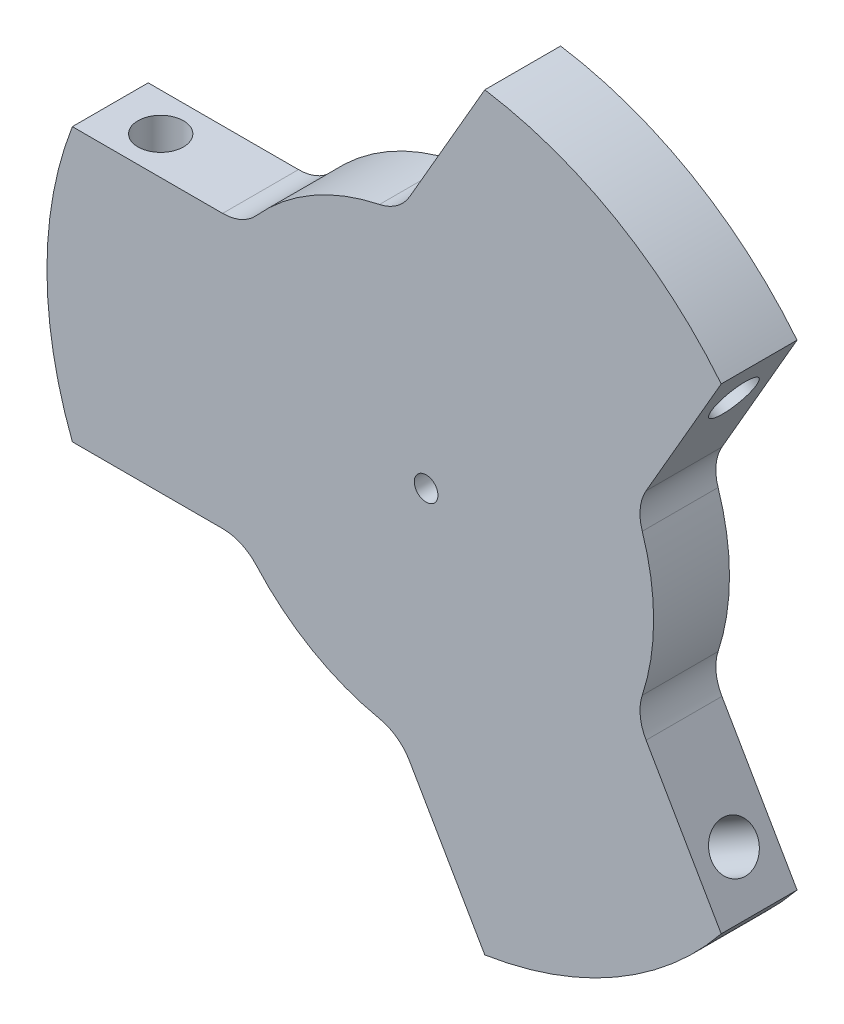
ISO-10303-21;
HEADER;
FILE_DESCRIPTION(('STEP AP214'),'2;1');
FILE_NAME('part.step','',(''),(''),'','','');
FILE_SCHEMA(('AUTOMOTIVE_DESIGN { 1 0 10303 214 1 1 1 1 }'));
ENDSEC;
DATA;
#1=APPLICATION_CONTEXT('core data for automotive mechanical design processes');
#2=APPLICATION_PROTOCOL_DEFINITION('international standard','automotive_design',2000,#1);
#3=PRODUCT_CONTEXT('',#1,'mechanical');
#4=PRODUCT('Part','Part','',(#3));
#5=PRODUCT_RELATED_PRODUCT_CATEGORY('part','',(#4));
#6=PRODUCT_DEFINITION_FORMATION('','',#4);
#7=PRODUCT_DEFINITION_CONTEXT('part definition',#1,'design');
#8=PRODUCT_DEFINITION('design','',#6,#7);
#9=PRODUCT_DEFINITION_SHAPE('','',#8);
#10=(LENGTH_UNIT() NAMED_UNIT(*) SI_UNIT(.MILLI.,.METRE.));
#11=(NAMED_UNIT(*) PLANE_ANGLE_UNIT() SI_UNIT($,.RADIAN.));
#12=(NAMED_UNIT(*) SI_UNIT($,.STERADIAN.) SOLID_ANGLE_UNIT());
#13=UNCERTAINTY_MEASURE_WITH_UNIT(LENGTH_MEASURE(1.E-05),#10,'distance_accuracy_value','');
#14=(GEOMETRIC_REPRESENTATION_CONTEXT(3) GLOBAL_UNCERTAINTY_ASSIGNED_CONTEXT((#13)) GLOBAL_UNIT_ASSIGNED_CONTEXT((#10,
#11,#12)) REPRESENTATION_CONTEXT('',''));
#15=CARTESIAN_POINT('',(0.,0.,0.));
#16=DIRECTION('',(0.,0.,1.));
#17=DIRECTION('',(1.,0.,0.));
#18=AXIS2_PLACEMENT_3D('',#15,#16,#17);
#19=CARTESIAN_POINT('',(0.,0.,5.));
#20=DIRECTION('',(0.,0.,-1.));
#21=DIRECTION('',(-1.,0.,0.));
#22=AXIS2_PLACEMENT_3D('',#19,#20,#21);
#23=CYLINDRICAL_SURFACE('',#22,25.);
#24=CARTESIAN_POINT('',(0.,0.,0.));
#25=DIRECTION('',(0.,0.,1.));
#26=DIRECTION('',(1.,0.,0.));
#27=AXIS2_PLACEMENT_3D('',#24,#25,#26);
#28=CIRCLE('',#27,25.);
#29=CARTESIAN_POINT('',(3.86767515563069,-24.6990098767242,0.));
#30=VERTEX_POINT('',#29);
#31=CARTESIAN_POINT('',(19.4561324237506,-15.6990098767241,0.));
#32=VERTEX_POINT('',#31);
#33=EDGE_CURVE('E197',#30,#32,#28,.T.);
#34=ORIENTED_EDGE('',*,*,#33,.T.);
#35=DIRECTION('',(0.,0.,1.));
#36=VECTOR('',#35,1.);
#37=CARTESIAN_POINT('',(19.4561324237506,-15.6990098767241,0.));
#38=LINE('',#37,#36);
#39=CARTESIAN_POINT('',(19.4561324237506,-15.6990098767241,5.));
#40=VERTEX_POINT('',#39);
#41=EDGE_CURVE('E192',#32,#40,#38,.T.);
#42=ORIENTED_EDGE('',*,*,#41,.T.);
#43=CARTESIAN_POINT('',(0.,0.,5.));
#44=DIRECTION('',(0.,0.,1.));
#45=DIRECTION('',(1.,0.,0.));
#46=AXIS2_PLACEMENT_3D('',#43,#44,#45);
#47=CIRCLE('',#46,25.);
#48=CARTESIAN_POINT('',(3.86767515563069,-24.6990098767242,5.));
#49=VERTEX_POINT('',#48);
#50=EDGE_CURVE('E212',#49,#40,#47,.T.);
#51=ORIENTED_EDGE('',*,*,#50,.F.);
#52=DIRECTION('',(0.,0.,1.));
#53=VECTOR('',#52,1.);
#54=CARTESIAN_POINT('',(3.86767515563069,-24.6990098767242,0.));
#55=LINE('',#54,#53);
#56=EDGE_CURVE('E306',#30,#49,#55,.T.);
#57=ORIENTED_EDGE('',*,*,#56,.F.);
#58=EDGE_LOOP('',(#34,#42,#51,#57));
#59=FACE_BOUND('',#58,.T.);
#60=ADVANCED_FACE('F38',(#59),#23,.T.);
#61=CARTESIAN_POINT('',(19.4561324237505,15.6990098767242,5.));
#62=VERTEX_POINT('',#61);
#63=CARTESIAN_POINT('',(3.86767515563063,24.6990098767242,5.));
#64=VERTEX_POINT('',#63);
#65=EDGE_CURVE('E191',#62,#64,#47,.T.);
#66=ORIENTED_EDGE('',*,*,#65,.F.);
#67=DIRECTION('',(0.,0.,1.));
#68=VECTOR('',#67,1.);
#69=CARTESIAN_POINT('',(19.4561324237505,15.6990098767242,0.));
#70=LINE('',#69,#68);
#71=CARTESIAN_POINT('',(19.4561324237505,15.6990098767242,0.));
#72=VERTEX_POINT('',#71);
#73=EDGE_CURVE('E174',#72,#62,#70,.T.);
#74=ORIENTED_EDGE('',*,*,#73,.F.);
#75=CARTESIAN_POINT('',(3.86767515563063,24.6990098767242,0.));
#76=VERTEX_POINT('',#75);
#77=EDGE_CURVE('E188',#72,#76,#28,.T.);
#78=ORIENTED_EDGE('',*,*,#77,.T.);
#79=DIRECTION('',(0.,0.,1.));
#80=VECTOR('',#79,1.);
#81=CARTESIAN_POINT('',(3.86767515563063,24.6990098767242,0.));
#82=LINE('',#81,#80);
#83=EDGE_CURVE('E198',#76,#64,#82,.T.);
#84=ORIENTED_EDGE('',*,*,#83,.T.);
#85=EDGE_LOOP('',(#66,#74,#78,#84));
#86=FACE_BOUND('',#85,.T.);
#87=ADVANCED_FACE('F186',(#86),#23,.T.);
#88=CARTESIAN_POINT('',(-23.3238075793812,9.,0.));
#89=VERTEX_POINT('',#88);
#90=CARTESIAN_POINT('',(-23.3238075793812,-9.,0.));
#91=VERTEX_POINT('',#90);
#92=EDGE_CURVE('E200',#89,#91,#28,.T.);
#93=ORIENTED_EDGE('',*,*,#92,.T.);
#94=DIRECTION('',(0.,0.,1.));
#95=VECTOR('',#94,1.);
#96=CARTESIAN_POINT('',(-23.3238075793812,-9.,0.));
#97=LINE('',#96,#95);
#98=CARTESIAN_POINT('',(-23.3238075793812,-9.,5.));
#99=VERTEX_POINT('',#98);
#100=EDGE_CURVE('E311',#91,#99,#97,.T.);
#101=ORIENTED_EDGE('',*,*,#100,.T.);
#102=CARTESIAN_POINT('',(-23.3238075793812,9.,5.));
#103=VERTEX_POINT('',#102);
#104=EDGE_CURVE('E213',#103,#99,#47,.T.);
#105=ORIENTED_EDGE('',*,*,#104,.F.);
#106=DIRECTION('',(0.,0.,1.));
#107=VECTOR('',#106,1.);
#108=CARTESIAN_POINT('',(-23.3238075793812,9.,0.));
#109=LINE('',#108,#107);
#110=EDGE_CURVE('E203',#89,#103,#109,.T.);
#111=ORIENTED_EDGE('',*,*,#110,.F.);
#112=EDGE_LOOP('',(#93,#101,#105,#111));
#113=FACE_BOUND('',#112,.T.);
#114=ADVANCED_FACE('F377',(#113),#23,.T.);
#115=CARTESIAN_POINT('',(0.,0.,5.));
#116=DIRECTION('',(0.,0.,1.));
#117=DIRECTION('',(1.,0.,0.));
#118=AXIS2_PLACEMENT_3D('',#115,#116,#117);
#119=PLANE('',#118);
#120=CARTESIAN_POINT('',(0.,0.,5.));
#121=DIRECTION('',(0.,0.,1.));
#122=DIRECTION('',(1.,0.,0.));
#123=AXIS2_PLACEMENT_3D('',#120,#121,#122);
#124=CIRCLE('',#123,0.78);
#125=CARTESIAN_POINT('',(0.78,0.,5.));
#126=VERTEX_POINT('',#125);
#127=EDGE_CURVE('E361',#126,#126,#124,.T.);
#128=ORIENTED_EDGE('',*,*,#127,.F.);
#129=EDGE_LOOP('',(#128));
#130=FACE_BOUND('',#129,.T.);
#131=DIRECTION('',(0.5,-0.866025403784438,0.));
#132=VECTOR('',#131,1.);
#133=CARTESIAN_POINT('',(13.79422863406,-5.89230484541324,5.));
#134=LINE('',#133,#132);
#135=CARTESIAN_POINT('',(14.5024325665593,-7.11895003862223,5.));
#136=VERTEX_POINT('',#135);
#137=EDGE_CURVE('E181',#136,#40,#134,.T.);
#138=ORIENTED_EDGE('',*,*,#137,.F.);
#139=CARTESIAN_POINT('',(17.1005087779126,-5.61895003862222,5.));
#140=DIRECTION('',(0.,0.,1.));
#141=DIRECTION('',(1.,0.,0.));
#142=AXIS2_PLACEMENT_3D('',#139,#140,#141);
#143=CIRCLE('',#142,3.);
#144=CARTESIAN_POINT('',(14.2504239815939,-4.68245836551852,5.));
#145=VERTEX_POINT('',#144);
#146=EDGE_CURVE('E266',#136,#145,#143,.F.);
#147=ORIENTED_EDGE('',*,*,#146,.T.);
#148=CARTESIAN_POINT('',(0.,0.,5.));
#149=DIRECTION('',(0.,0.,-1.));
#150=DIRECTION('',(1.,0.,0.));
#151=AXIS2_PLACEMENT_3D('',#148,#149,#150);
#152=CIRCLE('',#151,15.);
#153=CARTESIAN_POINT('',(14.2504239815939,4.68245836551856,5.));
#154=VERTEX_POINT('',#153);
#155=EDGE_CURVE('E339',#154,#145,#152,.T.);
#156=ORIENTED_EDGE('',*,*,#155,.F.);
#157=CARTESIAN_POINT('',(17.1005087779126,5.61895003862227,5.));
#158=DIRECTION('',(0.,0.,1.));
#159=DIRECTION('',(1.,0.,0.));
#160=AXIS2_PLACEMENT_3D('',#157,#158,#159);
#161=CIRCLE('',#160,3.);
#162=CARTESIAN_POINT('',(14.5024325665593,7.11895003862227,5.));
#163=VERTEX_POINT('',#162);
#164=EDGE_CURVE('E262',#154,#163,#161,.F.);
#165=ORIENTED_EDGE('',*,*,#164,.T.);
#166=DIRECTION('',(-0.5,-0.866025403784439,0.));
#167=VECTOR('',#166,1.);
#168=CARTESIAN_POINT('',(19.4561324237505,15.6990098767242,5.));
#169=LINE('',#168,#167);
#170=EDGE_CURVE('E341',#62,#163,#169,.T.);
#171=ORIENTED_EDGE('',*,*,#170,.F.);
#172=ORIENTED_EDGE('',*,*,#65,.T.);
#173=DIRECTION('',(0.5,0.866025403784439,0.));
#174=VECTOR('',#173,1.);
#175=CARTESIAN_POINT('',(-1.79422863405997,14.8923048454133,5.));
#176=LINE('',#175,#174);
#177=CARTESIAN_POINT('',(-1.0860247015606,16.1189500386222,5.));
#178=VERTEX_POINT('',#177);
#179=EDGE_CURVE('E290',#178,#64,#176,.T.);
#180=ORIENTED_EDGE('',*,*,#179,.F.);
#181=CARTESIAN_POINT('',(-3.68410091291392,17.6189500386222,5.));
#182=DIRECTION('',(0.,0.,1.));
#183=DIRECTION('',(1.,0.,0.));
#184=AXIS2_PLACEMENT_3D('',#181,#182,#183);
#185=CIRCLE('',#184,3.);
#186=CARTESIAN_POINT('',(-3.07008409409493,14.6824583655185,5.));
#187=VERTEX_POINT('',#186);
#188=EDGE_CURVE('E46',#178,#187,#185,.F.);
#189=ORIENTED_EDGE('',*,*,#188,.T.);
#190=CARTESIAN_POINT('',(0.,0.,5.));
#191=DIRECTION('',(0.,0.,-1.));
#192=DIRECTION('',(1.,0.,0.));
#193=AXIS2_PLACEMENT_3D('',#190,#191,#192);
#194=CIRCLE('',#193,15.);
#195=CARTESIAN_POINT('',(-11.180339887499,10.,5.));
#196=VERTEX_POINT('',#195);
#197=EDGE_CURVE('E289',#196,#187,#194,.T.);
#198=ORIENTED_EDGE('',*,*,#197,.F.);
#199=CARTESIAN_POINT('',(-13.4164078649987,12.,5.));
#200=DIRECTION('',(0.,0.,1.));
#201=DIRECTION('',(1.,0.,0.));
#202=AXIS2_PLACEMENT_3D('',#199,#200,#201);
#203=CIRCLE('',#202,3.);
#204=CARTESIAN_POINT('',(-13.4164078649987,9.,5.));
#205=VERTEX_POINT('',#204);
#206=EDGE_CURVE('E282',#196,#205,#203,.F.);
#207=ORIENTED_EDGE('',*,*,#206,.T.);
#208=DIRECTION('',(1.,0.,0.));
#209=VECTOR('',#208,1.);
#210=CARTESIAN_POINT('',(-23.3238075793812,9.,5.));
#211=LINE('',#210,#209);
#212=EDGE_CURVE('E295',#103,#205,#211,.T.);
#213=ORIENTED_EDGE('',*,*,#212,.F.);
#214=ORIENTED_EDGE('',*,*,#104,.T.);
#215=DIRECTION('',(-1.,0.,0.));
#216=VECTOR('',#215,1.);
#217=CARTESIAN_POINT('',(-12.,-9.,5.));
#218=LINE('',#217,#216);
#219=CARTESIAN_POINT('',(-13.4164078649987,-9.,5.));
#220=VERTEX_POINT('',#219);
#221=EDGE_CURVE('E321',#220,#99,#218,.T.);
#222=ORIENTED_EDGE('',*,*,#221,.F.);
#223=CARTESIAN_POINT('',(-13.4164078649987,-12.,5.));
#224=DIRECTION('',(0.,0.,1.));
#225=DIRECTION('',(1.,0.,0.));
#226=AXIS2_PLACEMENT_3D('',#223,#224,#225);
#227=CIRCLE('',#226,3.);
#228=CARTESIAN_POINT('',(-11.180339887499,-10.,5.));
#229=VERTEX_POINT('',#228);
#230=EDGE_CURVE('E276',#220,#229,#227,.F.);
#231=ORIENTED_EDGE('',*,*,#230,.T.);
#232=CARTESIAN_POINT('',(0.,0.,5.));
#233=DIRECTION('',(0.,0.,-1.));
#234=DIRECTION('',(1.,0.,0.));
#235=AXIS2_PLACEMENT_3D('',#232,#233,#234);
#236=CIRCLE('',#235,15.);
#237=CARTESIAN_POINT('',(-3.07008409409489,-14.6824583655186,5.));
#238=VERTEX_POINT('',#237);
#239=EDGE_CURVE('E323',#238,#229,#236,.T.);
#240=ORIENTED_EDGE('',*,*,#239,.F.);
#241=CARTESIAN_POINT('',(-3.68410091291387,-17.6189500386223,5.));
#242=DIRECTION('',(0.,0.,1.));
#243=DIRECTION('',(1.,0.,0.));
#244=AXIS2_PLACEMENT_3D('',#241,#242,#243);
#245=CIRCLE('',#244,3.);
#246=CARTESIAN_POINT('',(-1.08602470156055,-16.1189500386223,5.));
#247=VERTEX_POINT('',#246);
#248=EDGE_CURVE('E270',#238,#247,#245,.F.);
#249=ORIENTED_EDGE('',*,*,#248,.T.);
#250=DIRECTION('',(-0.500000000000001,0.866025403784438,0.));
#251=VECTOR('',#250,1.);
#252=CARTESIAN_POINT('',(3.86767515563068,-24.6990098767242,5.));
#253=LINE('',#252,#251);
#254=EDGE_CURVE('E316',#49,#247,#253,.T.);
#255=ORIENTED_EDGE('',*,*,#254,.F.);
#256=ORIENTED_EDGE('',*,*,#50,.T.);
#257=EDGE_LOOP('',(#138,#147,#156,#165,#171,#172,#180,#189,#198,#207,#213,#214,#222,#231,#240,
#249,#255,#256));
#258=FACE_BOUND('',#257,.T.);
#259=ADVANCED_FACE('F288',(#130,#258),#119,.T.);
#260=CARTESIAN_POINT('',(0.,0.,0.));
#261=DIRECTION('',(0.,0.,1.));
#262=DIRECTION('',(1.,0.,0.));
#263=AXIS2_PLACEMENT_3D('',#260,#261,#262);
#264=PLANE('',#263);
#265=CARTESIAN_POINT('',(0.,0.,0.));
#266=DIRECTION('',(0.,0.,1.));
#267=DIRECTION('',(1.,0.,0.));
#268=AXIS2_PLACEMENT_3D('',#265,#266,#267);
#269=CIRCLE('',#268,0.78);
#270=CARTESIAN_POINT('',(0.78,0.,0.));
#271=VERTEX_POINT('',#270);
#272=EDGE_CURVE('E360',#271,#271,#269,.T.);
#273=ORIENTED_EDGE('',*,*,#272,.T.);
#274=EDGE_LOOP('',(#273));
#275=FACE_BOUND('',#274,.T.);
#276=DIRECTION('',(-0.5,-0.866025403784439,0.));
#277=VECTOR('',#276,1.);
#278=CARTESIAN_POINT('',(19.4561324237505,15.6990098767242,0.));
#279=LINE('',#278,#277);
#280=CARTESIAN_POINT('',(14.5024325665593,7.11895003862227,0.));
#281=VERTEX_POINT('',#280);
#282=EDGE_CURVE('E170',#72,#281,#279,.T.);
#283=ORIENTED_EDGE('',*,*,#282,.T.);
#284=CARTESIAN_POINT('',(17.1005087779126,5.61895003862227,0.));
#285=DIRECTION('',(0.,0.,1.));
#286=DIRECTION('',(1.,0.,0.));
#287=AXIS2_PLACEMENT_3D('',#284,#285,#286);
#288=CIRCLE('',#287,3.);
#289=CARTESIAN_POINT('',(14.2504239815939,4.68245836551856,0.));
#290=VERTEX_POINT('',#289);
#291=EDGE_CURVE('E264',#281,#290,#288,.T.);
#292=ORIENTED_EDGE('',*,*,#291,.T.);
#293=CARTESIAN_POINT('',(0.,0.,0.));
#294=DIRECTION('',(0.,0.,-1.));
#295=DIRECTION('',(1.,0.,0.));
#296=AXIS2_PLACEMENT_3D('',#293,#294,#295);
#297=CIRCLE('',#296,15.);
#298=CARTESIAN_POINT('',(14.2504239815939,-4.68245836551852,0.));
#299=VERTEX_POINT('',#298);
#300=EDGE_CURVE('E180',#290,#299,#297,.T.);
#301=ORIENTED_EDGE('',*,*,#300,.T.);
#302=CARTESIAN_POINT('',(17.1005087779126,-5.61895003862222,0.));
#303=DIRECTION('',(0.,0.,1.));
#304=DIRECTION('',(1.,0.,0.));
#305=AXIS2_PLACEMENT_3D('',#302,#303,#304);
#306=CIRCLE('',#305,3.);
#307=CARTESIAN_POINT('',(14.5024325665593,-7.11895003862223,0.));
#308=VERTEX_POINT('',#307);
#309=EDGE_CURVE('E268',#299,#308,#306,.T.);
#310=ORIENTED_EDGE('',*,*,#309,.T.);
#311=DIRECTION('',(0.5,-0.866025403784438,0.));
#312=VECTOR('',#311,1.);
#313=CARTESIAN_POINT('',(13.79422863406,-5.89230484541324,0.));
#314=LINE('',#313,#312);
#315=EDGE_CURVE('E193',#308,#32,#314,.T.);
#316=ORIENTED_EDGE('',*,*,#315,.T.);
#317=ORIENTED_EDGE('',*,*,#33,.F.);
#318=DIRECTION('',(-0.500000000000001,0.866025403784438,0.));
#319=VECTOR('',#318,1.);
#320=CARTESIAN_POINT('',(3.86767515563068,-24.6990098767242,0.));
#321=LINE('',#320,#319);
#322=CARTESIAN_POINT('',(-1.08602470156055,-16.1189500386223,0.));
#323=VERTEX_POINT('',#322);
#324=EDGE_CURVE('E313',#30,#323,#321,.T.);
#325=ORIENTED_EDGE('',*,*,#324,.T.);
#326=CARTESIAN_POINT('',(-3.68410091291387,-17.6189500386223,0.));
#327=DIRECTION('',(0.,0.,1.));
#328=DIRECTION('',(1.,0.,0.));
#329=AXIS2_PLACEMENT_3D('',#326,#327,#328);
#330=CIRCLE('',#329,3.);
#331=CARTESIAN_POINT('',(-3.07008409409489,-14.6824583655186,0.));
#332=VERTEX_POINT('',#331);
#333=EDGE_CURVE('E273',#323,#332,#330,.T.);
#334=ORIENTED_EDGE('',*,*,#333,.T.);
#335=CARTESIAN_POINT('',(0.,0.,0.));
#336=DIRECTION('',(0.,0.,-1.));
#337=DIRECTION('',(1.,0.,0.));
#338=AXIS2_PLACEMENT_3D('',#335,#336,#337);
#339=CIRCLE('',#338,15.);
#340=CARTESIAN_POINT('',(-11.180339887499,-10.,0.));
#341=VERTEX_POINT('',#340);
#342=EDGE_CURVE('E320',#332,#341,#339,.T.);
#343=ORIENTED_EDGE('',*,*,#342,.T.);
#344=CARTESIAN_POINT('',(-13.4164078649987,-12.,0.));
#345=DIRECTION('',(0.,0.,1.));
#346=DIRECTION('',(1.,0.,0.));
#347=AXIS2_PLACEMENT_3D('',#344,#345,#346);
#348=CIRCLE('',#347,3.);
#349=CARTESIAN_POINT('',(-13.4164078649987,-9.,0.));
#350=VERTEX_POINT('',#349);
#351=EDGE_CURVE('E279',#341,#350,#348,.T.);
#352=ORIENTED_EDGE('',*,*,#351,.T.);
#353=DIRECTION('',(-1.,0.,0.));
#354=VECTOR('',#353,1.);
#355=CARTESIAN_POINT('',(-12.,-9.,0.));
#356=LINE('',#355,#354);
#357=EDGE_CURVE('E330',#350,#91,#356,.T.);
#358=ORIENTED_EDGE('',*,*,#357,.T.);
#359=ORIENTED_EDGE('',*,*,#92,.F.);
#360=DIRECTION('',(1.,0.,0.));
#361=VECTOR('',#360,1.);
#362=CARTESIAN_POINT('',(-23.3238075793812,9.,0.));
#363=LINE('',#362,#361);
#364=CARTESIAN_POINT('',(-13.4164078649987,9.,0.));
#365=VERTEX_POINT('',#364);
#366=EDGE_CURVE('E301',#89,#365,#363,.T.);
#367=ORIENTED_EDGE('',*,*,#366,.T.);
#368=CARTESIAN_POINT('',(-13.4164078649987,12.,0.));
#369=DIRECTION('',(0.,0.,1.));
#370=DIRECTION('',(1.,0.,0.));
#371=AXIS2_PLACEMENT_3D('',#368,#369,#370);
#372=CIRCLE('',#371,3.);
#373=CARTESIAN_POINT('',(-11.180339887499,10.,0.));
#374=VERTEX_POINT('',#373);
#375=EDGE_CURVE('E284',#365,#374,#372,.T.);
#376=ORIENTED_EDGE('',*,*,#375,.T.);
#377=CARTESIAN_POINT('',(0.,0.,0.));
#378=DIRECTION('',(0.,0.,-1.));
#379=DIRECTION('',(1.,0.,0.));
#380=AXIS2_PLACEMENT_3D('',#377,#378,#379);
#381=CIRCLE('',#380,15.);
#382=CARTESIAN_POINT('',(-3.07008409409493,14.6824583655185,0.));
#383=VERTEX_POINT('',#382);
#384=EDGE_CURVE('E299',#374,#383,#381,.T.);
#385=ORIENTED_EDGE('',*,*,#384,.T.);
#386=CARTESIAN_POINT('',(-3.68410091291392,17.6189500386222,0.));
#387=DIRECTION('',(0.,0.,1.));
#388=DIRECTION('',(1.,0.,0.));
#389=AXIS2_PLACEMENT_3D('',#386,#387,#388);
#390=CIRCLE('',#389,3.);
#391=CARTESIAN_POINT('',(-1.0860247015606,16.1189500386222,0.));
#392=VERTEX_POINT('',#391);
#393=EDGE_CURVE('E11',#383,#392,#390,.T.);
#394=ORIENTED_EDGE('',*,*,#393,.T.);
#395=DIRECTION('',(0.5,0.866025403784439,0.));
#396=VECTOR('',#395,1.);
#397=CARTESIAN_POINT('',(-1.79422863405997,14.8923048454133,0.));
#398=LINE('',#397,#396);
#399=EDGE_CURVE('E196',#392,#76,#398,.T.);
#400=ORIENTED_EDGE('',*,*,#399,.T.);
#401=ORIENTED_EDGE('',*,*,#77,.F.);
#402=EDGE_LOOP('',(#283,#292,#301,#310,#316,#317,#325,#334,#343,#352,#358,#359,#367,#376,#385,
#394,#400,#401));
#403=FACE_BOUND('',#402,.T.);
#404=ADVANCED_FACE('F195',(#275,#403),#264,.F.);
#405=CARTESIAN_POINT('',(-1.79422863405997,14.8923048454133,0.));
#406=DIRECTION('',(0.866025403784439,-0.5,0.));
#407=DIRECTION('',(0.5,0.866025403784439,0.));
#408=AXIS2_PLACEMENT_3D('',#405,#406,#407);
#409=PLANE('',#408);
#410=CARTESIAN_POINT('',(2.20577136594005,21.8205080756888,2.5));
#411=DIRECTION('',(0.866025403784439,-0.5,0.));
#412=DIRECTION('',(0.5,0.866025403784439,0.));
#413=AXIS2_PLACEMENT_3D('',#410,#411,#412);
#414=CIRCLE('',#413,1.5);
#415=CARTESIAN_POINT('',(2.95577136594006,23.1195461813655,2.5));
#416=VERTEX_POINT('',#415);
#417=EDGE_CURVE('E350',#416,#416,#414,.T.);
#418=ORIENTED_EDGE('',*,*,#417,.T.);
#419=EDGE_LOOP('',(#418));
#420=FACE_BOUND('',#419,.T.);
#421=ORIENTED_EDGE('',*,*,#399,.F.);
#422=DIRECTION('',(0.,0.,-1.));
#423=VECTOR('',#422,1.);
#424=CARTESIAN_POINT('',(-1.0860247015606,16.1189500386222,5.));
#425=LINE('',#424,#423);
#426=EDGE_CURVE('E260',#392,#178,#425,.F.);
#427=ORIENTED_EDGE('',*,*,#426,.T.);
#428=ORIENTED_EDGE('',*,*,#179,.T.);
#429=ORIENTED_EDGE('',*,*,#83,.F.);
#430=EDGE_LOOP('',(#421,#427,#428,#429));
#431=FACE_BOUND('',#430,.T.);
#432=ADVANCED_FACE('F298',(#420,#431),#409,.F.);
#433=CARTESIAN_POINT('',(0.,0.,0.));
#434=DIRECTION('',(0.,0.,1.));
#435=DIRECTION('',(1.,0.,0.));
#436=AXIS2_PLACEMENT_3D('',#433,#434,#435);
#437=CYLINDRICAL_SURFACE('',#436,15.);
#438=ORIENTED_EDGE('',*,*,#384,.F.);
#439=DIRECTION('',(0.,0.,1.));
#440=VECTOR('',#439,1.);
#441=CARTESIAN_POINT('',(-11.180339887499,10.,0.));
#442=LINE('',#441,#440);
#443=EDGE_CURVE('E255',#374,#196,#442,.T.);
#444=ORIENTED_EDGE('',*,*,#443,.T.);
#445=ORIENTED_EDGE('',*,*,#197,.T.);
#446=DIRECTION('',(0.,0.,1.));
#447=VECTOR('',#446,1.);
#448=CARTESIAN_POINT('',(-3.07008409409493,14.6824583655185,0.));
#449=LINE('',#448,#447);
#450=EDGE_CURVE('E253',#187,#383,#449,.F.);
#451=ORIENTED_EDGE('',*,*,#450,.T.);
#452=EDGE_LOOP('',(#438,#444,#445,#451));
#453=FACE_BOUND('',#452,.T.);
#454=ADVANCED_FACE('F293',(#453),#437,.T.);
#455=CARTESIAN_POINT('',(-23.3238075793812,9.,0.));
#456=DIRECTION('',(0.,-1.,0.));
#457=DIRECTION('',(0.,0.,-1.));
#458=AXIS2_PLACEMENT_3D('',#455,#456,#457);
#459=PLANE('',#458);
#460=CARTESIAN_POINT('',(-20.,9.,2.5));
#461=DIRECTION('',(0.,1.,0.));
#462=DIRECTION('',(0.,0.,1.));
#463=AXIS2_PLACEMENT_3D('',#460,#461,#462);
#464=CIRCLE('',#463,1.5);
#465=CARTESIAN_POINT('',(-20.,8.99999999999999,4.));
#466=VERTEX_POINT('',#465);
#467=EDGE_CURVE('E347',#466,#466,#464,.T.);
#468=ORIENTED_EDGE('',*,*,#467,.F.);
#469=EDGE_LOOP('',(#468));
#470=FACE_BOUND('',#469,.T.);
#471=ORIENTED_EDGE('',*,*,#212,.T.);
#472=DIRECTION('',(0.,0.,-1.));
#473=VECTOR('',#472,1.);
#474=CARTESIAN_POINT('',(-13.4164078649987,9.,0.));
#475=LINE('',#474,#473);
#476=EDGE_CURVE('E258',#205,#365,#475,.T.);
#477=ORIENTED_EDGE('',*,*,#476,.T.);
#478=ORIENTED_EDGE('',*,*,#366,.F.);
#479=ORIENTED_EDGE('',*,*,#110,.T.);
#480=EDGE_LOOP('',(#471,#477,#478,#479));
#481=FACE_BOUND('',#480,.T.);
#482=ADVANCED_FACE('F415',(#470,#481),#459,.F.);
#483=CARTESIAN_POINT('',(0.,0.,0.));
#484=DIRECTION('',(0.,0.,1.));
#485=DIRECTION('',(1.,0.,0.));
#486=AXIS2_PLACEMENT_3D('',#483,#484,#485);
#487=CYLINDRICAL_SURFACE('',#486,15.);
#488=ORIENTED_EDGE('',*,*,#342,.F.);
#489=DIRECTION('',(0.,0.,1.));
#490=VECTOR('',#489,1.);
#491=CARTESIAN_POINT('',(-3.07008409409489,-14.6824583655186,0.));
#492=LINE('',#491,#490);
#493=EDGE_CURVE('E243',#332,#238,#492,.T.);
#494=ORIENTED_EDGE('',*,*,#493,.T.);
#495=ORIENTED_EDGE('',*,*,#239,.T.);
#496=DIRECTION('',(0.,0.,1.));
#497=VECTOR('',#496,1.);
#498=CARTESIAN_POINT('',(-11.180339887499,-10.,0.));
#499=LINE('',#498,#497);
#500=EDGE_CURVE('E240',#229,#341,#499,.F.);
#501=ORIENTED_EDGE('',*,*,#500,.T.);
#502=EDGE_LOOP('',(#488,#494,#495,#501));
#503=FACE_BOUND('',#502,.T.);
#504=ADVANCED_FACE('F426',(#503),#487,.T.);
#505=CARTESIAN_POINT('',(3.86767515563068,-24.6990098767242,0.));
#506=DIRECTION('',(0.866025403784438,0.500000000000001,0.));
#507=DIRECTION('',(-0.500000000000001,0.866025403784438,0.));
#508=AXIS2_PLACEMENT_3D('',#505,#506,#507);
#509=PLANE('',#508);
#510=CARTESIAN_POINT('',(2.20577136593985,-21.8205080756888,2.5));
#511=DIRECTION('',(-0.866025403784443,-0.499999999999992,0.));
#512=DIRECTION('',(0.,0.,1.));
#513=AXIS2_PLACEMENT_3D('',#510,#511,#512);
#514=CIRCLE('',#513,1.5);
#515=CARTESIAN_POINT('',(2.20577136593985,-21.8205080756888,4.));
#516=VERTEX_POINT('',#515);
#517=EDGE_CURVE('E356',#516,#516,#514,.T.);
#518=ORIENTED_EDGE('',*,*,#517,.F.);
#519=EDGE_LOOP('',(#518));
#520=FACE_BOUND('',#519,.T.);
#521=ORIENTED_EDGE('',*,*,#254,.T.);
#522=DIRECTION('',(0.,0.,-1.));
#523=VECTOR('',#522,1.);
#524=CARTESIAN_POINT('',(-1.08602470156055,-16.1189500386223,0.));
#525=LINE('',#524,#523);
#526=EDGE_CURVE('E247',#247,#323,#525,.T.);
#527=ORIENTED_EDGE('',*,*,#526,.T.);
#528=ORIENTED_EDGE('',*,*,#324,.F.);
#529=ORIENTED_EDGE('',*,*,#56,.T.);
#530=EDGE_LOOP('',(#521,#527,#528,#529));
#531=FACE_BOUND('',#530,.T.);
#532=ADVANCED_FACE('F433',(#520,#531),#509,.F.);
#533=CARTESIAN_POINT('',(-12.,-9.,0.));
#534=DIRECTION('',(0.,1.,0.));
#535=DIRECTION('',(0.,0.,1.));
#536=AXIS2_PLACEMENT_3D('',#533,#534,#535);
#537=PLANE('',#536);
#538=CARTESIAN_POINT('',(-20.,-9.,2.5));
#539=DIRECTION('',(0.,1.,0.));
#540=DIRECTION('',(0.,0.,1.));
#541=AXIS2_PLACEMENT_3D('',#538,#539,#540);
#542=CIRCLE('',#541,1.5);
#543=CARTESIAN_POINT('',(-20.,-9.,4.));
#544=VERTEX_POINT('',#543);
#545=EDGE_CURVE('E343',#544,#544,#542,.T.);
#546=ORIENTED_EDGE('',*,*,#545,.T.);
#547=EDGE_LOOP('',(#546));
#548=FACE_BOUND('',#547,.T.);
#549=ORIENTED_EDGE('',*,*,#357,.F.);
#550=DIRECTION('',(0.,0.,-1.));
#551=VECTOR('',#550,1.);
#552=CARTESIAN_POINT('',(-13.4164078649987,-9.,5.));
#553=LINE('',#552,#551);
#554=EDGE_CURVE('E250',#350,#220,#553,.F.);
#555=ORIENTED_EDGE('',*,*,#554,.T.);
#556=ORIENTED_EDGE('',*,*,#221,.T.);
#557=ORIENTED_EDGE('',*,*,#100,.F.);
#558=EDGE_LOOP('',(#549,#555,#556,#557));
#559=FACE_BOUND('',#558,.T.);
#560=ADVANCED_FACE('F421',(#548,#559),#537,.F.);
#561=CARTESIAN_POINT('',(13.79422863406,-5.89230484541324,0.));
#562=DIRECTION('',(-0.866025403784438,-0.5,0.));
#563=DIRECTION('',(0.5,-0.866025403784438,0.));
#564=AXIS2_PLACEMENT_3D('',#561,#562,#563);
#565=PLANE('',#564);
#566=CARTESIAN_POINT('',(17.79422863406,-12.8205080756888,2.5));
#567=DIRECTION('',(-0.866025403784438,-0.5,0.));
#568=DIRECTION('',(0.5,-0.866025403784438,0.));
#569=AXIS2_PLACEMENT_3D('',#566,#567,#568);
#570=CIRCLE('',#569,1.5);
#571=CARTESIAN_POINT('',(18.54422863406,-14.1195461813655,2.5));
#572=VERTEX_POINT('',#571);
#573=EDGE_CURVE('E234',#572,#572,#570,.T.);
#574=ORIENTED_EDGE('',*,*,#573,.T.);
#575=EDGE_LOOP('',(#574));
#576=FACE_BOUND('',#575,.T.);
#577=ORIENTED_EDGE('',*,*,#315,.F.);
#578=DIRECTION('',(0.,0.,-1.));
#579=VECTOR('',#578,1.);
#580=CARTESIAN_POINT('',(14.5024325665593,-7.11895003862223,5.));
#581=LINE('',#580,#579);
#582=EDGE_CURVE('E237',#308,#136,#581,.F.);
#583=ORIENTED_EDGE('',*,*,#582,.T.);
#584=ORIENTED_EDGE('',*,*,#137,.T.);
#585=ORIENTED_EDGE('',*,*,#41,.F.);
#586=EDGE_LOOP('',(#577,#583,#584,#585));
#587=FACE_BOUND('',#586,.T.);
#588=ADVANCED_FACE('F441',(#576,#587),#565,.F.);
#589=CARTESIAN_POINT('',(0.,0.,0.));
#590=DIRECTION('',(0.,0.,1.));
#591=DIRECTION('',(1.,0.,0.));
#592=AXIS2_PLACEMENT_3D('',#589,#590,#591);
#593=CYLINDRICAL_SURFACE('',#592,15.);
#594=ORIENTED_EDGE('',*,*,#300,.F.);
#595=DIRECTION('',(0.,0.,1.));
#596=VECTOR('',#595,1.);
#597=CARTESIAN_POINT('',(14.2504239815939,4.68245836551856,0.));
#598=LINE('',#597,#596);
#599=EDGE_CURVE('E224',#290,#154,#598,.T.);
#600=ORIENTED_EDGE('',*,*,#599,.T.);
#601=ORIENTED_EDGE('',*,*,#155,.T.);
#602=DIRECTION('',(0.,0.,1.));
#603=VECTOR('',#602,1.);
#604=CARTESIAN_POINT('',(14.2504239815939,-4.68245836551852,0.));
#605=LINE('',#604,#603);
#606=EDGE_CURVE('E220',#145,#299,#605,.F.);
#607=ORIENTED_EDGE('',*,*,#606,.T.);
#608=EDGE_LOOP('',(#594,#600,#601,#607));
#609=FACE_BOUND('',#608,.T.);
#610=ADVANCED_FACE('F443',(#609),#593,.T.);
#611=CARTESIAN_POINT('',(19.4561324237505,15.6990098767242,0.));
#612=DIRECTION('',(-0.866025403784438,0.5,0.));
#613=DIRECTION('',(-0.5,-0.866025403784439,0.));
#614=AXIS2_PLACEMENT_3D('',#611,#612,#613);
#615=PLANE('',#614);
#616=CARTESIAN_POINT('',(17.79422863406,12.8205080756887,2.5));
#617=DIRECTION('',(0.866025403784436,-0.500000000000004,0.));
#618=DIRECTION('',(0.,0.,1.));
#619=AXIS2_PLACEMENT_3D('',#616,#617,#618);
#620=CIRCLE('',#619,1.5);
#621=CARTESIAN_POINT('',(17.79422863406,12.8205080756887,4.));
#622=VERTEX_POINT('',#621);
#623=EDGE_CURVE('E353',#622,#622,#620,.T.);
#624=ORIENTED_EDGE('',*,*,#623,.F.);
#625=EDGE_LOOP('',(#624));
#626=FACE_BOUND('',#625,.T.);
#627=ORIENTED_EDGE('',*,*,#170,.T.);
#628=DIRECTION('',(0.,0.,-1.));
#629=VECTOR('',#628,1.);
#630=CARTESIAN_POINT('',(14.5024325665593,7.11895003862227,0.));
#631=LINE('',#630,#629);
#632=EDGE_CURVE('E177',#163,#281,#631,.T.);
#633=ORIENTED_EDGE('',*,*,#632,.T.);
#634=ORIENTED_EDGE('',*,*,#282,.F.);
#635=ORIENTED_EDGE('',*,*,#73,.T.);
#636=EDGE_LOOP('',(#627,#633,#634,#635));
#637=FACE_BOUND('',#636,.T.);
#638=ADVANCED_FACE('F173',(#626,#637),#615,.F.);
#639=CARTESIAN_POINT('',(-20.,-24.6990098767242,2.5));
#640=DIRECTION('',(0.,1.,0.));
#641=DIRECTION('',(0.,0.,1.));
#642=AXIS2_PLACEMENT_3D('',#639,#640,#641);
#643=CYLINDRICAL_SURFACE('',#642,1.5);
#644=CARTESIAN_POINT('',(-20.,8.99999999999999,4.));
#645=CARTESIAN_POINT('',(-20.,8.81249999999999,4.));
#646=CARTESIAN_POINT('',(-20.,8.62499999999999,4.));
#647=CARTESIAN_POINT('',(-20.,8.24999999999999,4.));
#648=CARTESIAN_POINT('',(-20.,8.06249999999999,4.));
#649=CARTESIAN_POINT('',(-20.,7.68749999999999,4.));
#650=CARTESIAN_POINT('',(-20.,7.49999999999999,4.));
#651=CARTESIAN_POINT('',(-20.,7.12499999999999,4.));
#652=CARTESIAN_POINT('',(-20.,6.93749999999999,4.));
#653=CARTESIAN_POINT('',(-20.,6.56249999999999,4.));
#654=CARTESIAN_POINT('',(-20.,6.375,4.));
#655=CARTESIAN_POINT('',(-20.,6.,4.));
#656=CARTESIAN_POINT('',(-20.,5.8125,4.));
#657=CARTESIAN_POINT('',(-20.,5.4375,4.));
#658=CARTESIAN_POINT('',(-20.,5.25,4.));
#659=CARTESIAN_POINT('',(-20.,4.875,4.));
#660=CARTESIAN_POINT('',(-20.,4.6875,4.));
#661=CARTESIAN_POINT('',(-20.,4.3125,4.));
#662=CARTESIAN_POINT('',(-20.,4.125,4.));
#663=CARTESIAN_POINT('',(-20.,3.75,4.));
#664=CARTESIAN_POINT('',(-20.,3.5625,4.));
#665=CARTESIAN_POINT('',(-20.,3.1875,4.));
#666=CARTESIAN_POINT('',(-20.,3.,4.));
#667=CARTESIAN_POINT('',(-20.,2.625,4.));
#668=CARTESIAN_POINT('',(-20.,2.4375,4.));
#669=CARTESIAN_POINT('',(-20.,2.0625,4.));
#670=CARTESIAN_POINT('',(-20.,1.875,4.));
#671=CARTESIAN_POINT('',(-20.,1.5,4.));
#672=CARTESIAN_POINT('',(-20.,1.3125,4.));
#673=CARTESIAN_POINT('',(-20.,0.937499999999999,4.));
#674=CARTESIAN_POINT('',(-20.,0.749999999999999,4.));
#675=CARTESIAN_POINT('',(-20.,0.375,4.));
#676=CARTESIAN_POINT('',(-20.,0.1875,4.));
#677=CARTESIAN_POINT('',(-20.,-0.1875,4.));
#678=CARTESIAN_POINT('',(-20.,-0.375,4.));
#679=CARTESIAN_POINT('',(-20.,-0.749999999999999,4.));
#680=CARTESIAN_POINT('',(-20.,-0.937499999999999,4.));
#681=CARTESIAN_POINT('',(-20.,-1.3125,4.));
#682=CARTESIAN_POINT('',(-20.,-1.5,4.));
#683=CARTESIAN_POINT('',(-20.,-1.875,4.));
#684=CARTESIAN_POINT('',(-20.,-2.0625,4.));
#685=CARTESIAN_POINT('',(-20.,-2.4375,4.));
#686=CARTESIAN_POINT('',(-20.,-2.625,4.));
#687=CARTESIAN_POINT('',(-20.,-3.,4.));
#688=CARTESIAN_POINT('',(-20.,-3.1875,4.));
#689=CARTESIAN_POINT('',(-20.,-3.5625,4.));
#690=CARTESIAN_POINT('',(-20.,-3.75,4.));
#691=CARTESIAN_POINT('',(-20.,-4.125,4.));
#692=CARTESIAN_POINT('',(-20.,-4.3125,4.));
#693=CARTESIAN_POINT('',(-20.,-4.6875,4.));
#694=CARTESIAN_POINT('',(-20.,-4.875,4.));
#695=CARTESIAN_POINT('',(-20.,-5.25,4.));
#696=CARTESIAN_POINT('',(-20.,-5.4375,4.));
#697=CARTESIAN_POINT('',(-20.,-5.8125,4.));
#698=CARTESIAN_POINT('',(-20.,-6.,4.));
#699=CARTESIAN_POINT('',(-20.,-6.375,4.));
#700=CARTESIAN_POINT('',(-20.,-6.5625,4.));
#701=CARTESIAN_POINT('',(-20.,-6.9375,4.));
#702=CARTESIAN_POINT('',(-20.,-7.125,4.));
#703=CARTESIAN_POINT('',(-20.,-7.5,4.));
#704=CARTESIAN_POINT('',(-20.,-7.6875,4.));
#705=CARTESIAN_POINT('',(-20.,-8.0625,4.));
#706=CARTESIAN_POINT('',(-20.,-8.25,4.));
#707=CARTESIAN_POINT('',(-20.,-8.625,4.));
#708=CARTESIAN_POINT('',(-20.,-8.8125,4.));
#709=CARTESIAN_POINT('',(-20.,-9.,4.));
#710=B_SPLINE_CURVE_WITH_KNOTS('',3,(#644,#645,#646,#647,#648,#649,#650,#651,#652,#653,#654,
#655,#656,#657,#658,#659,#660,#661,#662,#663,#664,#665,#666,#667,#668,#669,#670,#671,#672,#673,
#674,#675,#676,#677,#678,#679,#680,#681,#682,#683,#684,#685,#686,#687,#688,#689,#690,#691,#692,
#693,#694,#695,#696,#697,#698,#699,#700,#701,#702,#703,#704,#705,#706,#707,#708,#709),
.UNSPECIFIED.,.F.,.F.,(4,2,2,2,2,2,2,2,2,2,2,2,2,2,2,2,2,2,2,2,2,2,2,2,2,2,2,2,2,2,2,2,4),(0.,
0.5625,1.125,1.6875,2.25,2.8125,3.375,3.9375,4.49999999999999,5.06249999999999,5.62499999999999,
6.18749999999999,6.75,7.3125,7.875,8.43749999999999,8.99999999999999,9.56249999999999,10.125,
10.6875,11.25,11.8125,12.375,12.9375,13.5,14.0625,14.625,15.1875,15.75,16.3125,16.875,17.4375,
18.),.UNSPECIFIED.);
#711=EDGE_CURVE('BSEAM451',#466,#544,#710,.T.);
#712=ORIENTED_EDGE('',*,*,#467,.T.);
#713=ORIENTED_EDGE('',*,*,#545,.F.);
#714=ORIENTED_EDGE('',*,*,#711,.T.);
#715=ORIENTED_EDGE('',*,*,#711,.F.);
#716=EDGE_LOOP('',(#712,#714,#713,#715));
#717=FACE_BOUND('',#716,.T.);
#718=ADVANCED_FACE('F451',(#717),#643,.F.);
#719=CARTESIAN_POINT('',(-19.4449850007828,34.3205780921754,2.5));
#720=DIRECTION('',(0.866025403784436,-0.500000000000004,0.));
#721=DIRECTION('',(0.500000000000004,0.866025403784436,0.));
#722=AXIS2_PLACEMENT_3D('',#719,#720,#721);
#723=CYLINDRICAL_SURFACE('',#722,1.5);
#724=ORIENTED_EDGE('',*,*,#623,.T.);
#725=EDGE_LOOP('',(#724));
#726=FACE_BOUND('',#725,.T.);
#727=ORIENTED_EDGE('',*,*,#417,.F.);
#728=EDGE_LOOP('',(#727));
#729=FACE_BOUND('',#728,.T.);
#730=ADVANCED_FACE('F479',(#726,#729),#723,.F.);
#731=CARTESIAN_POINT('',(35.2870843185957,-2.72100313732707,2.5));
#732=DIRECTION('',(-0.866025403784443,-0.499999999999992,0.));
#733=DIRECTION('',(0.499999999999992,-0.866025403784443,0.));
#734=AXIS2_PLACEMENT_3D('',#731,#732,#733);
#735=CYLINDRICAL_SURFACE('',#734,1.5);
#736=ORIENTED_EDGE('',*,*,#517,.T.);
#737=EDGE_LOOP('',(#736));
#738=FACE_BOUND('',#737,.T.);
#739=ORIENTED_EDGE('',*,*,#573,.F.);
#740=EDGE_LOOP('',(#739));
#741=FACE_BOUND('',#740,.T.);
#742=ADVANCED_FACE('F372',(#738,#741),#735,.F.);
#743=CARTESIAN_POINT('',(0.,0.,0.));
#744=DIRECTION('',(0.,0.,1.));
#745=DIRECTION('',(1.,0.,0.));
#746=AXIS2_PLACEMENT_3D('',#743,#744,#745);
#747=CYLINDRICAL_SURFACE('',#746,0.78);
#748=ORIENTED_EDGE('',*,*,#272,.F.);
#749=EDGE_LOOP('',(#748));
#750=FACE_BOUND('',#749,.T.);
#751=ORIENTED_EDGE('',*,*,#127,.T.);
#752=EDGE_LOOP('',(#751));
#753=FACE_BOUND('',#752,.T.);
#754=ADVANCED_FACE('F368',(#750,#753),#747,.F.);
#755=CARTESIAN_POINT('',(17.1005087779126,5.61895003862227,0.));
#756=DIRECTION('',(0.,0.,1.));
#757=DIRECTION('',(1.,0.,0.));
#758=AXIS2_PLACEMENT_3D('',#755,#756,#757);
#759=CYLINDRICAL_SURFACE('',#758,3.);
#760=ORIENTED_EDGE('',*,*,#291,.F.);
#761=ORIENTED_EDGE('',*,*,#632,.F.);
#762=ORIENTED_EDGE('',*,*,#164,.F.);
#763=ORIENTED_EDGE('',*,*,#599,.F.);
#764=EDGE_LOOP('',(#760,#761,#762,#763));
#765=FACE_BOUND('',#764,.T.);
#766=ADVANCED_FACE('F371',(#765),#759,.F.);
#767=CARTESIAN_POINT('',(17.1005087779126,-5.61895003862222,0.));
#768=DIRECTION('',(0.,0.,1.));
#769=DIRECTION('',(1.,0.,0.));
#770=AXIS2_PLACEMENT_3D('',#767,#768,#769);
#771=CYLINDRICAL_SURFACE('',#770,3.);
#772=ORIENTED_EDGE('',*,*,#309,.F.);
#773=ORIENTED_EDGE('',*,*,#606,.F.);
#774=ORIENTED_EDGE('',*,*,#146,.F.);
#775=ORIENTED_EDGE('',*,*,#582,.F.);
#776=EDGE_LOOP('',(#772,#773,#774,#775));
#777=FACE_BOUND('',#776,.T.);
#778=ADVANCED_FACE('F395',(#777),#771,.F.);
#779=CARTESIAN_POINT('',(-3.68410091291387,-17.6189500386223,0.));
#780=DIRECTION('',(0.,0.,1.));
#781=DIRECTION('',(1.,0.,0.));
#782=AXIS2_PLACEMENT_3D('',#779,#780,#781);
#783=CYLINDRICAL_SURFACE('',#782,3.);
#784=ORIENTED_EDGE('',*,*,#333,.F.);
#785=ORIENTED_EDGE('',*,*,#526,.F.);
#786=ORIENTED_EDGE('',*,*,#248,.F.);
#787=ORIENTED_EDGE('',*,*,#493,.F.);
#788=EDGE_LOOP('',(#784,#785,#786,#787));
#789=FACE_BOUND('',#788,.T.);
#790=ADVANCED_FACE('F399',(#789),#783,.F.);
#791=CARTESIAN_POINT('',(-13.4164078649987,-12.,0.));
#792=DIRECTION('',(0.,0.,1.));
#793=DIRECTION('',(1.,0.,0.));
#794=AXIS2_PLACEMENT_3D('',#791,#792,#793);
#795=CYLINDRICAL_SURFACE('',#794,3.);
#796=ORIENTED_EDGE('',*,*,#351,.F.);
#797=ORIENTED_EDGE('',*,*,#500,.F.);
#798=ORIENTED_EDGE('',*,*,#230,.F.);
#799=ORIENTED_EDGE('',*,*,#554,.F.);
#800=EDGE_LOOP('',(#796,#797,#798,#799));
#801=FACE_BOUND('',#800,.T.);
#802=ADVANCED_FACE('F403',(#801),#795,.F.);
#803=CARTESIAN_POINT('',(-13.4164078649987,12.,0.));
#804=DIRECTION('',(0.,0.,1.));
#805=DIRECTION('',(1.,0.,0.));
#806=AXIS2_PLACEMENT_3D('',#803,#804,#805);
#807=CYLINDRICAL_SURFACE('',#806,3.);
#808=ORIENTED_EDGE('',*,*,#375,.F.);
#809=ORIENTED_EDGE('',*,*,#476,.F.);
#810=ORIENTED_EDGE('',*,*,#206,.F.);
#811=ORIENTED_EDGE('',*,*,#443,.F.);
#812=EDGE_LOOP('',(#808,#809,#810,#811));
#813=FACE_BOUND('',#812,.T.);
#814=ADVANCED_FACE('F406',(#813),#807,.F.);
#815=CARTESIAN_POINT('',(-3.68410091291392,17.6189500386222,0.));
#816=DIRECTION('',(0.,0.,1.));
#817=DIRECTION('',(1.,0.,0.));
#818=AXIS2_PLACEMENT_3D('',#815,#816,#817);
#819=CYLINDRICAL_SURFACE('',#818,3.);
#820=ORIENTED_EDGE('',*,*,#393,.F.);
#821=ORIENTED_EDGE('',*,*,#450,.F.);
#822=ORIENTED_EDGE('',*,*,#188,.F.);
#823=ORIENTED_EDGE('',*,*,#426,.F.);
#824=EDGE_LOOP('',(#820,#821,#822,#823));
#825=FACE_BOUND('',#824,.T.);
#826=ADVANCED_FACE('F40',(#825),#819,.F.);
#827=CLOSED_SHELL('',(#60,#87,#114,#259,#404,#432,#454,#482,#504,#532,#560,#588,#610,#638,#718,
#730,#742,#754,#766,#778,#790,#802,#814,#826));
#828=MANIFOLD_SOLID_BREP('B2',#827);
#829=ADVANCED_BREP_SHAPE_REPRESENTATION('',(#18,#828),#14);
#830=SHAPE_DEFINITION_REPRESENTATION(#9,#829);
ENDSEC;
END-ISO-10303-21;
